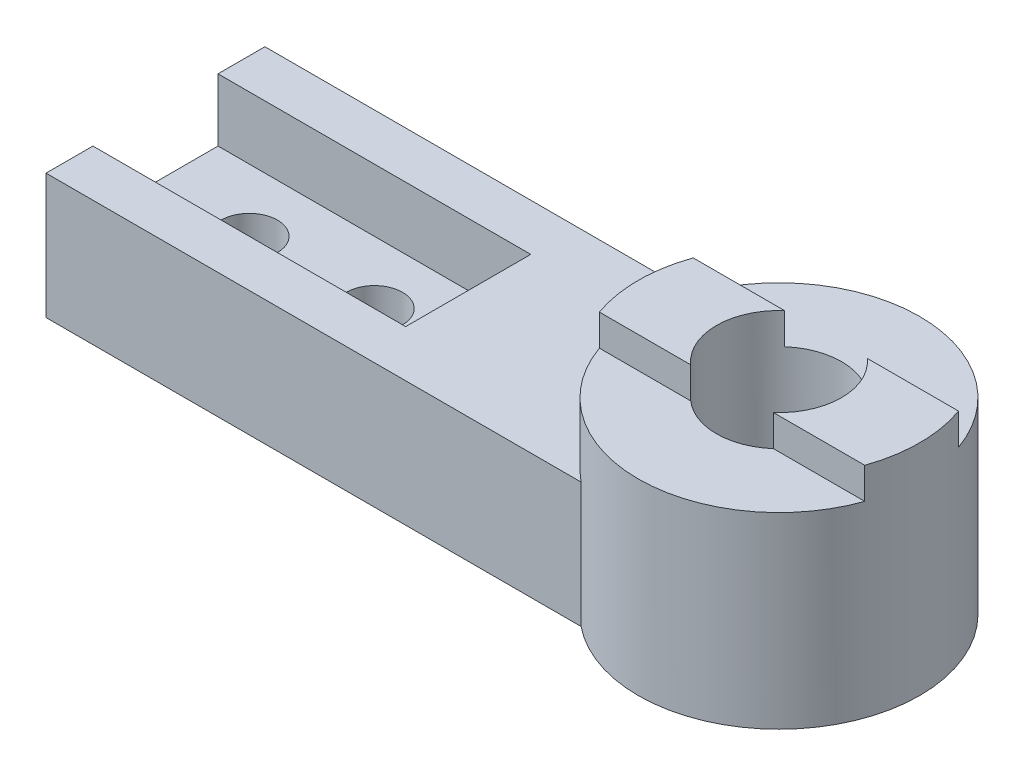
ISO-10303-21;
HEADER;
FILE_DESCRIPTION(('STEP AP214'),'2;1');
FILE_NAME('part.step','',(''),(''),'','','');
FILE_SCHEMA(('AUTOMOTIVE_DESIGN { 1 0 10303 214 1 1 1 1 }'));
ENDSEC;
DATA;
#1=APPLICATION_CONTEXT('core data for automotive mechanical design processes');
#2=APPLICATION_PROTOCOL_DEFINITION('international standard','automotive_design',2000,#1);
#3=PRODUCT_CONTEXT('',#1,'mechanical');
#4=PRODUCT('Part','Part','',(#3));
#5=PRODUCT_RELATED_PRODUCT_CATEGORY('part','',(#4));
#6=PRODUCT_DEFINITION_FORMATION('','',#4);
#7=PRODUCT_DEFINITION_CONTEXT('part definition',#1,'design');
#8=PRODUCT_DEFINITION('design','',#6,#7);
#9=PRODUCT_DEFINITION_SHAPE('','',#8);
#10=(LENGTH_UNIT() NAMED_UNIT(*) SI_UNIT(.MILLI.,.METRE.));
#11=(NAMED_UNIT(*) PLANE_ANGLE_UNIT() SI_UNIT($,.RADIAN.));
#12=(NAMED_UNIT(*) SI_UNIT($,.STERADIAN.) SOLID_ANGLE_UNIT());
#13=UNCERTAINTY_MEASURE_WITH_UNIT(LENGTH_MEASURE(1.E-05),#10,'distance_accuracy_value','');
#14=(GEOMETRIC_REPRESENTATION_CONTEXT(3) GLOBAL_UNCERTAINTY_ASSIGNED_CONTEXT((#13)) GLOBAL_UNIT_ASSIGNED_CONTEXT((#10,
#11,#12)) REPRESENTATION_CONTEXT('',''));
#15=CARTESIAN_POINT('',(0.,0.,0.));
#16=DIRECTION('',(0.,0.,1.));
#17=DIRECTION('',(1.,0.,0.));
#18=AXIS2_PLACEMENT_3D('',#15,#16,#17);
#19=CARTESIAN_POINT('',(0.,30.,0.));
#20=DIRECTION('',(0.,-1.,0.));
#21=DIRECTION('',(0.,0.,-1.));
#22=AXIS2_PLACEMENT_3D('',#19,#20,#21);
#23=CYLINDRICAL_SURFACE('',#22,22.5);
#24=CARTESIAN_POINT('',(0.,30.,0.));
#25=DIRECTION('',(0.,1.,0.));
#26=DIRECTION('',(0.,0.,1.));
#27=AXIS2_PLACEMENT_3D('',#24,#25,#26);
#28=CIRCLE('',#27,22.5);
#29=CARTESIAN_POINT('',(21.2132034355964,30.,-7.5));
#30=VERTEX_POINT('',#29);
#31=CARTESIAN_POINT('',(-21.2132034355964,30.,-7.5));
#32=VERTEX_POINT('',#31);
#33=EDGE_CURVE('E11',#30,#32,#28,.T.);
#34=ORIENTED_EDGE('',*,*,#33,.F.);
#35=DIRECTION('',(0.,-1.,0.));
#36=VECTOR('',#35,1.);
#37=CARTESIAN_POINT('',(21.2132034355964,35.,-7.5));
#38=LINE('',#37,#36);
#39=CARTESIAN_POINT('',(21.2132034355964,35.,-7.5));
#40=VERTEX_POINT('',#39);
#41=EDGE_CURVE('E291',#40,#30,#38,.T.);
#42=ORIENTED_EDGE('',*,*,#41,.F.);
#43=CARTESIAN_POINT('',(0.,35.,0.));
#44=DIRECTION('',(0.,1.,0.));
#45=DIRECTION('',(0.,0.,1.));
#46=AXIS2_PLACEMENT_3D('',#43,#44,#45);
#47=CIRCLE('',#46,22.5);
#48=CARTESIAN_POINT('',(21.2132034355964,35.,7.5));
#49=VERTEX_POINT('',#48);
#50=EDGE_CURVE('E275',#49,#40,#47,.T.);
#51=ORIENTED_EDGE('',*,*,#50,.F.);
#52=DIRECTION('',(0.,-1.,0.));
#53=VECTOR('',#52,1.);
#54=CARTESIAN_POINT('',(21.2132034355964,35.,7.5));
#55=LINE('',#54,#53);
#56=CARTESIAN_POINT('',(21.2132034355964,30.,7.5));
#57=VERTEX_POINT('',#56);
#58=EDGE_CURVE('E295',#49,#57,#55,.T.);
#59=ORIENTED_EDGE('',*,*,#58,.T.);
#60=CARTESIAN_POINT('',(-21.2132034355964,30.,7.5));
#61=VERTEX_POINT('',#60);
#62=EDGE_CURVE('E54',#61,#57,#28,.T.);
#63=ORIENTED_EDGE('',*,*,#62,.F.);
#64=DIRECTION('',(0.,-1.,0.));
#65=VECTOR('',#64,1.);
#66=CARTESIAN_POINT('',(-21.2132034355964,35.,7.5));
#67=LINE('',#66,#65);
#68=CARTESIAN_POINT('',(-21.2132034355964,35.,7.5));
#69=VERTEX_POINT('',#68);
#70=EDGE_CURVE('E233',#69,#61,#67,.T.);
#71=ORIENTED_EDGE('',*,*,#70,.F.);
#72=CARTESIAN_POINT('',(0.,35.,0.));
#73=DIRECTION('',(0.,1.,0.));
#74=DIRECTION('',(0.,0.,1.));
#75=AXIS2_PLACEMENT_3D('',#72,#73,#74);
#76=CIRCLE('',#75,22.5);
#77=CARTESIAN_POINT('',(-21.2132034355964,35.,-7.5));
#78=VERTEX_POINT('',#77);
#79=EDGE_CURVE('E251',#78,#69,#76,.T.);
#80=ORIENTED_EDGE('',*,*,#79,.F.);
#81=DIRECTION('',(0.,-1.,0.));
#82=VECTOR('',#81,1.);
#83=CARTESIAN_POINT('',(-21.2132034355964,35.,-7.5));
#84=LINE('',#83,#82);
#85=EDGE_CURVE('E242',#78,#32,#84,.T.);
#86=ORIENTED_EDGE('',*,*,#85,.T.);
#87=EDGE_LOOP('',(#34,#42,#51,#59,#63,#71,#80,#86));
#88=FACE_BOUND('',#87,.T.);
#89=DIRECTION('',(0.,-1.,0.));
#90=VECTOR('',#89,1.);
#91=CARTESIAN_POINT('',(-14.1421356237309,20.,-17.5));
#92=LINE('',#91,#90);
#93=CARTESIAN_POINT('',(-14.1421356237309,20.,-17.5));
#94=VERTEX_POINT('',#93);
#95=CARTESIAN_POINT('',(-14.1421356237309,0.,-17.5));
#96=VERTEX_POINT('',#95);
#97=EDGE_CURVE('E207',#94,#96,#92,.T.);
#98=ORIENTED_EDGE('',*,*,#97,.F.);
#99=CARTESIAN_POINT('',(0.,20.,0.));
#100=DIRECTION('',(0.,-1.,0.));
#101=DIRECTION('',(0.,0.,1.));
#102=AXIS2_PLACEMENT_3D('',#99,#100,#101);
#103=CIRCLE('',#102,22.5);
#104=CARTESIAN_POINT('',(-14.1421356237309,20.,17.5));
#105=VERTEX_POINT('',#104);
#106=EDGE_CURVE('E69',#105,#94,#103,.T.);
#107=ORIENTED_EDGE('',*,*,#106,.F.);
#108=DIRECTION('',(0.,-1.,0.));
#109=VECTOR('',#108,1.);
#110=CARTESIAN_POINT('',(-14.1421356237309,20.,17.5));
#111=LINE('',#110,#109);
#112=CARTESIAN_POINT('',(-14.1421356237309,0.,17.5));
#113=VERTEX_POINT('',#112);
#114=EDGE_CURVE('E222',#105,#113,#111,.T.);
#115=ORIENTED_EDGE('',*,*,#114,.T.);
#116=CARTESIAN_POINT('',(0.,0.,0.));
#117=DIRECTION('',(0.,1.,0.));
#118=DIRECTION('',(0.,0.,1.));
#119=AXIS2_PLACEMENT_3D('',#116,#117,#118);
#120=CIRCLE('',#119,22.5);
#121=EDGE_CURVE('E48',#113,#96,#120,.T.);
#122=ORIENTED_EDGE('',*,*,#121,.T.);
#123=EDGE_LOOP('',(#98,#107,#115,#122));
#124=FACE_BOUND('',#123,.T.);
#125=ADVANCED_FACE('F45',(#88,#124),#23,.T.);
#126=CARTESIAN_POINT('',(0.,30.,0.));
#127=DIRECTION('',(0.,1.,0.));
#128=DIRECTION('',(0.,0.,1.));
#129=AXIS2_PLACEMENT_3D('',#126,#127,#128);
#130=PLANE('',#129);
#131=CARTESIAN_POINT('',(0.,30.,0.));
#132=DIRECTION('',(0.,1.,0.));
#133=DIRECTION('',(0.,0.,1.));
#134=AXIS2_PLACEMENT_3D('',#131,#132,#133);
#135=CIRCLE('',#134,10.);
#136=CARTESIAN_POINT('',(-6.61437827766148,30.,7.5));
#137=VERTEX_POINT('',#136);
#138=CARTESIAN_POINT('',(6.61437827766148,30.,7.5));
#139=VERTEX_POINT('',#138);
#140=EDGE_CURVE('E308',#137,#139,#135,.T.);
#141=ORIENTED_EDGE('',*,*,#140,.F.);
#142=DIRECTION('',(1.,0.,0.));
#143=VECTOR('',#142,1.);
#144=CARTESIAN_POINT('',(-6.61437827766148,30.,7.5));
#145=LINE('',#144,#143);
#146=EDGE_CURVE('E250',#61,#137,#145,.T.);
#147=ORIENTED_EDGE('',*,*,#146,.F.);
#148=ORIENTED_EDGE('',*,*,#62,.T.);
#149=DIRECTION('',(1.,0.,0.));
#150=VECTOR('',#149,1.);
#151=CARTESIAN_POINT('',(21.2132034355964,30.,7.5));
#152=LINE('',#151,#150);
#153=EDGE_CURVE('E255',#139,#57,#152,.T.);
#154=ORIENTED_EDGE('',*,*,#153,.F.);
#155=EDGE_LOOP('',(#141,#147,#148,#154));
#156=FACE_BOUND('',#155,.T.);
#157=ADVANCED_FACE('F325',(#156),#130,.T.);
#158=ORIENTED_EDGE('',*,*,#33,.T.);
#159=DIRECTION('',(-1.,0.,0.));
#160=VECTOR('',#159,1.);
#161=CARTESIAN_POINT('',(-6.61437827766148,30.,-7.5));
#162=LINE('',#161,#160);
#163=CARTESIAN_POINT('',(-6.61437827766148,30.,-7.5));
#164=VERTEX_POINT('',#163);
#165=EDGE_CURVE('E247',#164,#32,#162,.T.);
#166=ORIENTED_EDGE('',*,*,#165,.F.);
#167=CARTESIAN_POINT('',(6.61437827766148,30.,-7.5));
#168=VERTEX_POINT('',#167);
#169=EDGE_CURVE('E304',#168,#164,#135,.T.);
#170=ORIENTED_EDGE('',*,*,#169,.F.);
#171=DIRECTION('',(-1.,0.,0.));
#172=VECTOR('',#171,1.);
#173=CARTESIAN_POINT('',(21.2132034355964,30.,-7.5));
#174=LINE('',#173,#172);
#175=EDGE_CURVE('E272',#30,#168,#174,.T.);
#176=ORIENTED_EDGE('',*,*,#175,.F.);
#177=EDGE_LOOP('',(#158,#166,#170,#176));
#178=FACE_BOUND('',#177,.T.);
#179=ADVANCED_FACE('F341',(#178),#130,.T.);
#180=CARTESIAN_POINT('',(0.,0.,0.));
#181=DIRECTION('',(0.,1.,0.));
#182=DIRECTION('',(0.,0.,1.));
#183=AXIS2_PLACEMENT_3D('',#180,#181,#182);
#184=PLANE('',#183);
#185=CARTESIAN_POINT('',(-84.6832270174227,0.,0.));
#186=DIRECTION('',(0.,1.,0.));
#187=DIRECTION('',(0.,0.,1.));
#188=AXIS2_PLACEMENT_3D('',#185,#186,#187);
#189=CIRCLE('',#188,4.5);
#190=CARTESIAN_POINT('',(-84.6832270174227,0.,4.5));
#191=VERTEX_POINT('',#190);
#192=EDGE_CURVE('E402',#191,#191,#189,.T.);
#193=ORIENTED_EDGE('',*,*,#192,.T.);
#194=EDGE_LOOP('',(#193));
#195=FACE_BOUND('',#194,.T.);
#196=CARTESIAN_POINT('',(-64.6832270174227,0.,0.));
#197=DIRECTION('',(0.,1.,0.));
#198=DIRECTION('',(0.,0.,1.));
#199=AXIS2_PLACEMENT_3D('',#196,#197,#198);
#200=CIRCLE('',#199,4.5);
#201=CARTESIAN_POINT('',(-64.6832270174227,0.,4.5));
#202=VERTEX_POINT('',#201);
#203=EDGE_CURVE('E405',#202,#202,#200,.T.);
#204=ORIENTED_EDGE('',*,*,#203,.T.);
#205=EDGE_LOOP('',(#204));
#206=FACE_BOUND('',#205,.T.);
#207=ORIENTED_EDGE('',*,*,#121,.F.);
#208=DIRECTION('',(1.,0.,0.));
#209=VECTOR('',#208,1.);
#210=CARTESIAN_POINT('',(-14.1421356237309,0.,17.5));
#211=LINE('',#210,#209);
#212=CARTESIAN_POINT('',(-99.6832270174227,0.,17.5));
#213=VERTEX_POINT('',#212);
#214=EDGE_CURVE('E197',#213,#113,#211,.T.);
#215=ORIENTED_EDGE('',*,*,#214,.F.);
#216=DIRECTION('',(0.,0.,1.));
#217=VECTOR('',#216,1.);
#218=CARTESIAN_POINT('',(-99.6832270174227,0.,-17.5));
#219=LINE('',#218,#217);
#220=CARTESIAN_POINT('',(-99.6832270174227,0.,-17.5));
#221=VERTEX_POINT('',#220);
#222=EDGE_CURVE('E212',#221,#213,#219,.T.);
#223=ORIENTED_EDGE('',*,*,#222,.F.);
#224=DIRECTION('',(-1.,0.,0.));
#225=VECTOR('',#224,1.);
#226=CARTESIAN_POINT('',(-14.1421356237309,0.,-17.5));
#227=LINE('',#226,#225);
#228=EDGE_CURVE('E208',#96,#221,#227,.T.);
#229=ORIENTED_EDGE('',*,*,#228,.F.);
#230=EDGE_LOOP('',(#207,#215,#223,#229));
#231=FACE_BOUND('',#230,.T.);
#232=CARTESIAN_POINT('',(0.,0.,0.));
#233=DIRECTION('',(0.,1.,0.));
#234=DIRECTION('',(0.,0.,1.));
#235=AXIS2_PLACEMENT_3D('',#232,#233,#234);
#236=CIRCLE('',#235,10.);
#237=CARTESIAN_POINT('',(0.,0.,10.));
#238=VERTEX_POINT('',#237);
#239=EDGE_CURVE('E303',#238,#238,#236,.T.);
#240=ORIENTED_EDGE('',*,*,#239,.T.);
#241=EDGE_LOOP('',(#240));
#242=FACE_BOUND('',#241,.T.);
#243=ADVANCED_FACE('F364',(#195,#206,#231,#242),#184,.F.);
#244=CARTESIAN_POINT('',(0.,30.,0.));
#245=DIRECTION('',(0.,-1.,0.));
#246=DIRECTION('',(0.,0.,-1.));
#247=AXIS2_PLACEMENT_3D('',#244,#245,#246);
#248=CYLINDRICAL_SURFACE('',#247,10.);
#249=ORIENTED_EDGE('',*,*,#169,.T.);
#250=DIRECTION('',(0.,-1.,0.));
#251=VECTOR('',#250,1.);
#252=CARTESIAN_POINT('',(-6.61437827766148,35.,-7.5));
#253=LINE('',#252,#251);
#254=CARTESIAN_POINT('',(-6.61437827766148,35.,-7.5));
#255=VERTEX_POINT('',#254);
#256=EDGE_CURVE('E239',#255,#164,#253,.T.);
#257=ORIENTED_EDGE('',*,*,#256,.F.);
#258=CARTESIAN_POINT('',(0.,35.,0.));
#259=DIRECTION('',(0.,-1.,0.));
#260=DIRECTION('',(0.,0.,1.));
#261=AXIS2_PLACEMENT_3D('',#258,#259,#260);
#262=CIRCLE('',#261,10.);
#263=CARTESIAN_POINT('',(-6.61437827766148,35.,7.5));
#264=VERTEX_POINT('',#263);
#265=EDGE_CURVE('E258',#264,#255,#262,.T.);
#266=ORIENTED_EDGE('',*,*,#265,.F.);
#267=DIRECTION('',(0.,-1.,0.));
#268=VECTOR('',#267,1.);
#269=CARTESIAN_POINT('',(-6.61437827766148,35.,7.5));
#270=LINE('',#269,#268);
#271=EDGE_CURVE('E236',#264,#137,#270,.T.);
#272=ORIENTED_EDGE('',*,*,#271,.T.);
#273=ORIENTED_EDGE('',*,*,#140,.T.);
#274=DIRECTION('',(0.,-1.,0.));
#275=VECTOR('',#274,1.);
#276=CARTESIAN_POINT('',(6.61437827766148,35.,7.5));
#277=LINE('',#276,#275);
#278=CARTESIAN_POINT('',(6.61437827766148,35.,7.5));
#279=VERTEX_POINT('',#278);
#280=EDGE_CURVE('E299',#279,#139,#277,.T.);
#281=ORIENTED_EDGE('',*,*,#280,.F.);
#282=CARTESIAN_POINT('',(0.,35.,0.));
#283=DIRECTION('',(0.,-1.,0.));
#284=DIRECTION('',(0.,0.,1.));
#285=AXIS2_PLACEMENT_3D('',#282,#283,#284);
#286=CIRCLE('',#285,10.);
#287=CARTESIAN_POINT('',(6.61437827766148,35.,-7.5));
#288=VERTEX_POINT('',#287);
#289=EDGE_CURVE('E267',#288,#279,#286,.T.);
#290=ORIENTED_EDGE('',*,*,#289,.F.);
#291=DIRECTION('',(0.,-1.,0.));
#292=VECTOR('',#291,1.);
#293=CARTESIAN_POINT('',(6.61437827766148,35.,-7.5));
#294=LINE('',#293,#292);
#295=EDGE_CURVE('E281',#288,#168,#294,.T.);
#296=ORIENTED_EDGE('',*,*,#295,.T.);
#297=EDGE_LOOP('',(#249,#257,#266,#272,#273,#281,#290,#296));
#298=FACE_BOUND('',#297,.T.);
#299=ORIENTED_EDGE('',*,*,#239,.F.);
#300=EDGE_LOOP('',(#299));
#301=FACE_BOUND('',#300,.T.);
#302=ADVANCED_FACE('F318',(#298,#301),#248,.F.);
#303=CARTESIAN_POINT('',(21.2132034355964,35.,7.5));
#304=DIRECTION('',(0.,0.,-1.));
#305=DIRECTION('',(-1.,0.,0.));
#306=AXIS2_PLACEMENT_3D('',#303,#304,#305);
#307=PLANE('',#306);
#308=ORIENTED_EDGE('',*,*,#153,.T.);
#309=ORIENTED_EDGE('',*,*,#58,.F.);
#310=DIRECTION('',(1.,0.,0.));
#311=VECTOR('',#310,1.);
#312=CARTESIAN_POINT('',(21.2132034355964,35.,7.5));
#313=LINE('',#312,#311);
#314=EDGE_CURVE('E271',#279,#49,#313,.T.);
#315=ORIENTED_EDGE('',*,*,#314,.F.);
#316=ORIENTED_EDGE('',*,*,#280,.T.);
#317=EDGE_LOOP('',(#308,#309,#315,#316));
#318=FACE_BOUND('',#317,.T.);
#319=ADVANCED_FACE('F329',(#318),#307,.F.);
#320=CARTESIAN_POINT('',(21.2132034355964,35.,-7.5));
#321=DIRECTION('',(0.,0.,1.));
#322=DIRECTION('',(1.,0.,0.));
#323=AXIS2_PLACEMENT_3D('',#320,#321,#322);
#324=PLANE('',#323);
#325=ORIENTED_EDGE('',*,*,#175,.T.);
#326=ORIENTED_EDGE('',*,*,#295,.F.);
#327=DIRECTION('',(-1.,0.,0.));
#328=VECTOR('',#327,1.);
#329=CARTESIAN_POINT('',(21.2132034355964,35.,-7.5));
#330=LINE('',#329,#328);
#331=EDGE_CURVE('E278',#40,#288,#330,.T.);
#332=ORIENTED_EDGE('',*,*,#331,.F.);
#333=ORIENTED_EDGE('',*,*,#41,.T.);
#334=EDGE_LOOP('',(#325,#326,#332,#333));
#335=FACE_BOUND('',#334,.T.);
#336=ADVANCED_FACE('F337',(#335),#324,.F.);
#337=CARTESIAN_POINT('',(0.,35.,0.));
#338=DIRECTION('',(0.,1.,0.));
#339=DIRECTION('',(0.,0.,1.));
#340=AXIS2_PLACEMENT_3D('',#337,#338,#339);
#341=PLANE('',#340);
#342=ORIENTED_EDGE('',*,*,#289,.T.);
#343=ORIENTED_EDGE('',*,*,#314,.T.);
#344=ORIENTED_EDGE('',*,*,#50,.T.);
#345=ORIENTED_EDGE('',*,*,#331,.T.);
#346=EDGE_LOOP('',(#342,#343,#344,#345));
#347=FACE_BOUND('',#346,.T.);
#348=ADVANCED_FACE('F332',(#347),#341,.T.);
#349=CARTESIAN_POINT('',(-6.61437827766148,35.,7.5));
#350=DIRECTION('',(0.,0.,-1.));
#351=DIRECTION('',(-1.,0.,0.));
#352=AXIS2_PLACEMENT_3D('',#349,#350,#351);
#353=PLANE('',#352);
#354=ORIENTED_EDGE('',*,*,#146,.T.);
#355=ORIENTED_EDGE('',*,*,#271,.F.);
#356=DIRECTION('',(1.,0.,0.));
#357=VECTOR('',#356,1.);
#358=CARTESIAN_POINT('',(-6.61437827766148,35.,7.5));
#359=LINE('',#358,#357);
#360=EDGE_CURVE('E261',#69,#264,#359,.T.);
#361=ORIENTED_EDGE('',*,*,#360,.F.);
#362=ORIENTED_EDGE('',*,*,#70,.T.);
#363=EDGE_LOOP('',(#354,#355,#361,#362));
#364=FACE_BOUND('',#363,.T.);
#365=ADVANCED_FACE('F353',(#364),#353,.F.);
#366=CARTESIAN_POINT('',(-6.61437827766148,35.,-7.5));
#367=DIRECTION('',(0.,0.,1.));
#368=DIRECTION('',(1.,0.,0.));
#369=AXIS2_PLACEMENT_3D('',#366,#367,#368);
#370=PLANE('',#369);
#371=ORIENTED_EDGE('',*,*,#165,.T.);
#372=ORIENTED_EDGE('',*,*,#85,.F.);
#373=DIRECTION('',(-1.,0.,0.));
#374=VECTOR('',#373,1.);
#375=CARTESIAN_POINT('',(-6.61437827766148,35.,-7.5));
#376=LINE('',#375,#374);
#377=EDGE_CURVE('E246',#255,#78,#376,.T.);
#378=ORIENTED_EDGE('',*,*,#377,.F.);
#379=ORIENTED_EDGE('',*,*,#256,.T.);
#380=EDGE_LOOP('',(#371,#372,#378,#379));
#381=FACE_BOUND('',#380,.T.);
#382=ADVANCED_FACE('F349',(#381),#370,.F.);
#383=CARTESIAN_POINT('',(0.,35.,0.));
#384=DIRECTION('',(0.,1.,0.));
#385=DIRECTION('',(0.,0.,1.));
#386=AXIS2_PLACEMENT_3D('',#383,#384,#385);
#387=PLANE('',#386);
#388=ORIENTED_EDGE('',*,*,#79,.T.);
#389=ORIENTED_EDGE('',*,*,#360,.T.);
#390=ORIENTED_EDGE('',*,*,#265,.T.);
#391=ORIENTED_EDGE('',*,*,#377,.T.);
#392=EDGE_LOOP('',(#388,#389,#390,#391));
#393=FACE_BOUND('',#392,.T.);
#394=ADVANCED_FACE('F351',(#393),#387,.T.);
#395=CARTESIAN_POINT('',(-14.1421356237309,20.,-17.5));
#396=DIRECTION('',(0.,0.,1.));
#397=DIRECTION('',(1.,0.,0.));
#398=AXIS2_PLACEMENT_3D('',#395,#396,#397);
#399=PLANE('',#398);
#400=ORIENTED_EDGE('',*,*,#228,.T.);
#401=DIRECTION('',(0.,-1.,0.));
#402=VECTOR('',#401,1.);
#403=CARTESIAN_POINT('',(-99.6832270174227,20.,-17.5));
#404=LINE('',#403,#402);
#405=CARTESIAN_POINT('',(-99.6832270174227,20.,-17.5));
#406=VERTEX_POINT('',#405);
#407=EDGE_CURVE('E229',#406,#221,#404,.T.);
#408=ORIENTED_EDGE('',*,*,#407,.F.);
#409=DIRECTION('',(-1.,0.,0.));
#410=VECTOR('',#409,1.);
#411=CARTESIAN_POINT('',(-14.1421356237309,20.,-17.5));
#412=LINE('',#411,#410);
#413=EDGE_CURVE('E193',#94,#406,#412,.T.);
#414=ORIENTED_EDGE('',*,*,#413,.F.);
#415=ORIENTED_EDGE('',*,*,#97,.T.);
#416=EDGE_LOOP('',(#400,#408,#414,#415));
#417=FACE_BOUND('',#416,.T.);
#418=ADVANCED_FACE('F362',(#417),#399,.F.);
#419=CARTESIAN_POINT('',(-99.6832270174227,20.,-17.5));
#420=DIRECTION('',(1.,0.,0.));
#421=DIRECTION('',(0.,0.,-1.));
#422=AXIS2_PLACEMENT_3D('',#419,#420,#421);
#423=PLANE('',#422);
#424=DIRECTION('',(0.,0.,1.));
#425=VECTOR('',#424,1.);
#426=CARTESIAN_POINT('',(-99.6832270174227,10.,10.));
#427=LINE('',#426,#425);
#428=CARTESIAN_POINT('',(-99.6832270174227,10.,-10.));
#429=VERTEX_POINT('',#428);
#430=CARTESIAN_POINT('',(-99.6832270174227,10.,10.));
#431=VERTEX_POINT('',#430);
#432=EDGE_CURVE('E168',#429,#431,#427,.T.);
#433=ORIENTED_EDGE('',*,*,#432,.F.);
#434=DIRECTION('',(0.,1.,0.));
#435=VECTOR('',#434,1.);
#436=CARTESIAN_POINT('',(-99.6832270174227,10.,-10.));
#437=LINE('',#436,#435);
#438=CARTESIAN_POINT('',(-99.6832270174227,20.,-10.));
#439=VERTEX_POINT('',#438);
#440=EDGE_CURVE('E213',#429,#439,#437,.T.);
#441=ORIENTED_EDGE('',*,*,#440,.T.);
#442=DIRECTION('',(0.,0.,1.));
#443=VECTOR('',#442,1.);
#444=CARTESIAN_POINT('',(-99.6832270174227,20.,-17.5));
#445=LINE('',#444,#443);
#446=EDGE_CURVE('E198',#406,#439,#445,.T.);
#447=ORIENTED_EDGE('',*,*,#446,.F.);
#448=ORIENTED_EDGE('',*,*,#407,.T.);
#449=ORIENTED_EDGE('',*,*,#222,.T.);
#450=DIRECTION('',(0.,-1.,0.));
#451=VECTOR('',#450,1.);
#452=CARTESIAN_POINT('',(-99.6832270174227,20.,17.5));
#453=LINE('',#452,#451);
#454=CARTESIAN_POINT('',(-99.6832270174227,20.,17.5));
#455=VERTEX_POINT('',#454);
#456=EDGE_CURVE('E225',#455,#213,#453,.T.);
#457=ORIENTED_EDGE('',*,*,#456,.F.);
#458=CARTESIAN_POINT('',(-99.6832270174227,20.,9.99999999999999));
#459=VERTEX_POINT('',#458);
#460=EDGE_CURVE('E183',#459,#455,#445,.T.);
#461=ORIENTED_EDGE('',*,*,#460,.F.);
#462=DIRECTION('',(0.,1.,0.));
#463=VECTOR('',#462,1.);
#464=CARTESIAN_POINT('',(-99.6832270174227,10.,10.));
#465=LINE('',#464,#463);
#466=EDGE_CURVE('E61',#431,#459,#465,.T.);
#467=ORIENTED_EDGE('',*,*,#466,.F.);
#468=EDGE_LOOP('',(#433,#441,#447,#448,#449,#457,#461,#467));
#469=FACE_BOUND('',#468,.T.);
#470=ADVANCED_FACE('F181',(#469),#423,.F.);
#471=CARTESIAN_POINT('',(-14.1421356237309,20.,17.5));
#472=DIRECTION('',(0.,0.,-1.));
#473=DIRECTION('',(-1.,0.,0.));
#474=AXIS2_PLACEMENT_3D('',#471,#472,#473);
#475=PLANE('',#474);
#476=ORIENTED_EDGE('',*,*,#214,.T.);
#477=ORIENTED_EDGE('',*,*,#114,.F.);
#478=DIRECTION('',(1.,0.,0.));
#479=VECTOR('',#478,1.);
#480=CARTESIAN_POINT('',(-14.1421356237309,20.,17.5));
#481=LINE('',#480,#479);
#482=EDGE_CURVE('E202',#455,#105,#481,.T.);
#483=ORIENTED_EDGE('',*,*,#482,.F.);
#484=ORIENTED_EDGE('',*,*,#456,.T.);
#485=EDGE_LOOP('',(#476,#477,#483,#484));
#486=FACE_BOUND('',#485,.T.);
#487=ADVANCED_FACE('F370',(#486),#475,.F.);
#488=CARTESIAN_POINT('',(0.,20.,0.));
#489=DIRECTION('',(0.,1.,0.));
#490=DIRECTION('',(0.,0.,1.));
#491=AXIS2_PLACEMENT_3D('',#488,#489,#490);
#492=PLANE('',#491);
#493=DIRECTION('',(-1.,0.,0.));
#494=VECTOR('',#493,1.);
#495=CARTESIAN_POINT('',(-99.6832270174227,20.,-10.));
#496=LINE('',#495,#494);
#497=CARTESIAN_POINT('',(-49.6832270174227,20.,-10.));
#498=VERTEX_POINT('',#497);
#499=EDGE_CURVE('E178',#498,#439,#496,.T.);
#500=ORIENTED_EDGE('',*,*,#499,.F.);
#501=DIRECTION('',(0.,0.,-1.));
#502=VECTOR('',#501,1.);
#503=CARTESIAN_POINT('',(-49.6832270174227,20.,-10.));
#504=LINE('',#503,#502);
#505=CARTESIAN_POINT('',(-49.6832270174227,20.,9.99999999999999));
#506=VERTEX_POINT('',#505);
#507=EDGE_CURVE('E421',#506,#498,#504,.T.);
#508=ORIENTED_EDGE('',*,*,#507,.F.);
#509=DIRECTION('',(1.,0.,0.));
#510=VECTOR('',#509,1.);
#511=CARTESIAN_POINT('',(-49.6832270174227,20.,9.99999999999999));
#512=LINE('',#511,#510);
#513=EDGE_CURVE('E418',#459,#506,#512,.T.);
#514=ORIENTED_EDGE('',*,*,#513,.F.);
#515=ORIENTED_EDGE('',*,*,#460,.T.);
#516=ORIENTED_EDGE('',*,*,#482,.T.);
#517=ORIENTED_EDGE('',*,*,#106,.T.);
#518=ORIENTED_EDGE('',*,*,#413,.T.);
#519=ORIENTED_EDGE('',*,*,#446,.T.);
#520=EDGE_LOOP('',(#500,#508,#514,#515,#516,#517,#518,#519));
#521=FACE_BOUND('',#520,.T.);
#522=ADVANCED_FACE('F367',(#521),#492,.T.);
#523=CARTESIAN_POINT('',(-99.6832270174227,10.,-10.));
#524=DIRECTION('',(0.,0.,-1.));
#525=DIRECTION('',(-1.,0.,0.));
#526=AXIS2_PLACEMENT_3D('',#523,#524,#525);
#527=PLANE('',#526);
#528=ORIENTED_EDGE('',*,*,#499,.T.);
#529=ORIENTED_EDGE('',*,*,#440,.F.);
#530=DIRECTION('',(-1.,0.,0.));
#531=VECTOR('',#530,1.);
#532=CARTESIAN_POINT('',(-99.6832270174227,10.,-10.));
#533=LINE('',#532,#531);
#534=CARTESIAN_POINT('',(-49.6832270174227,10.,-10.));
#535=VERTEX_POINT('',#534);
#536=EDGE_CURVE('E174',#535,#429,#533,.T.);
#537=ORIENTED_EDGE('',*,*,#536,.F.);
#538=DIRECTION('',(0.,1.,0.));
#539=VECTOR('',#538,1.);
#540=CARTESIAN_POINT('',(-49.6832270174227,10.,-10.));
#541=LINE('',#540,#539);
#542=EDGE_CURVE('E188',#535,#498,#541,.T.);
#543=ORIENTED_EDGE('',*,*,#542,.T.);
#544=EDGE_LOOP('',(#528,#529,#537,#543));
#545=FACE_BOUND('',#544,.T.);
#546=ADVANCED_FACE('F378',(#545),#527,.F.);
#547=CARTESIAN_POINT('',(-49.6832270174227,10.,-10.));
#548=DIRECTION('',(1.,0.,0.));
#549=DIRECTION('',(0.,0.,-1.));
#550=AXIS2_PLACEMENT_3D('',#547,#548,#549);
#551=PLANE('',#550);
#552=ORIENTED_EDGE('',*,*,#507,.T.);
#553=ORIENTED_EDGE('',*,*,#542,.F.);
#554=DIRECTION('',(0.,0.,-1.));
#555=VECTOR('',#554,1.);
#556=CARTESIAN_POINT('',(-49.6832270174227,10.,-10.));
#557=LINE('',#556,#555);
#558=CARTESIAN_POINT('',(-49.6832270174227,10.,9.99999999999999));
#559=VERTEX_POINT('',#558);
#560=EDGE_CURVE('E167',#559,#535,#557,.T.);
#561=ORIENTED_EDGE('',*,*,#560,.F.);
#562=DIRECTION('',(0.,1.,0.));
#563=VECTOR('',#562,1.);
#564=CARTESIAN_POINT('',(-49.6832270174227,10.,9.99999999999999));
#565=LINE('',#564,#563);
#566=EDGE_CURVE('E162',#559,#506,#565,.T.);
#567=ORIENTED_EDGE('',*,*,#566,.T.);
#568=EDGE_LOOP('',(#552,#553,#561,#567));
#569=FACE_BOUND('',#568,.T.);
#570=ADVANCED_FACE('F432',(#569),#551,.F.);
#571=CARTESIAN_POINT('',(-49.6832270174227,10.,9.99999999999999));
#572=DIRECTION('',(0.,0.,1.));
#573=DIRECTION('',(1.,0.,0.));
#574=AXIS2_PLACEMENT_3D('',#571,#572,#573);
#575=PLANE('',#574);
#576=ORIENTED_EDGE('',*,*,#513,.T.);
#577=ORIENTED_EDGE('',*,*,#566,.F.);
#578=DIRECTION('',(1.,0.,0.));
#579=VECTOR('',#578,1.);
#580=CARTESIAN_POINT('',(-49.6832270174227,10.,9.99999999999999));
#581=LINE('',#580,#579);
#582=EDGE_CURVE('E159',#431,#559,#581,.T.);
#583=ORIENTED_EDGE('',*,*,#582,.F.);
#584=ORIENTED_EDGE('',*,*,#466,.T.);
#585=EDGE_LOOP('',(#576,#577,#583,#584));
#586=FACE_BOUND('',#585,.T.);
#587=ADVANCED_FACE('F161',(#586),#575,.F.);
#588=CARTESIAN_POINT('',(0.,10.,0.));
#589=DIRECTION('',(0.,-1.,0.));
#590=DIRECTION('',(0.,0.,-1.));
#591=AXIS2_PLACEMENT_3D('',#588,#589,#590);
#592=PLANE('',#591);
#593=CARTESIAN_POINT('',(-84.6832270174227,10.,0.));
#594=DIRECTION('',(0.,1.,0.));
#595=DIRECTION('',(0.,0.,1.));
#596=AXIS2_PLACEMENT_3D('',#593,#594,#595);
#597=CIRCLE('',#596,4.5);
#598=CARTESIAN_POINT('',(-84.6832270174227,10.,4.5));
#599=VERTEX_POINT('',#598);
#600=EDGE_CURVE('E412',#599,#599,#597,.T.);
#601=ORIENTED_EDGE('',*,*,#600,.F.);
#602=EDGE_LOOP('',(#601));
#603=FACE_BOUND('',#602,.T.);
#604=CARTESIAN_POINT('',(-64.6832270174227,10.,0.));
#605=DIRECTION('',(0.,1.,0.));
#606=DIRECTION('',(0.,0.,1.));
#607=AXIS2_PLACEMENT_3D('',#604,#605,#606);
#608=CIRCLE('',#607,4.5);
#609=CARTESIAN_POINT('',(-64.6832270174227,10.,4.5));
#610=VERTEX_POINT('',#609);
#611=EDGE_CURVE('E408',#610,#610,#608,.T.);
#612=ORIENTED_EDGE('',*,*,#611,.F.);
#613=EDGE_LOOP('',(#612));
#614=FACE_BOUND('',#613,.T.);
#615=ORIENTED_EDGE('',*,*,#432,.T.);
#616=ORIENTED_EDGE('',*,*,#582,.T.);
#617=ORIENTED_EDGE('',*,*,#560,.T.);
#618=ORIENTED_EDGE('',*,*,#536,.T.);
#619=EDGE_LOOP('',(#615,#616,#617,#618));
#620=FACE_BOUND('',#619,.T.);
#621=ADVANCED_FACE('F172',(#603,#614,#620),#592,.F.);
#622=CARTESIAN_POINT('',(-64.6832270174227,0.,0.));
#623=DIRECTION('',(0.,1.,0.));
#624=DIRECTION('',(0.,0.,1.));
#625=AXIS2_PLACEMENT_3D('',#622,#623,#624);
#626=CYLINDRICAL_SURFACE('',#625,4.5);
#627=ORIENTED_EDGE('',*,*,#203,.F.);
#628=EDGE_LOOP('',(#627));
#629=FACE_BOUND('',#628,.T.);
#630=ORIENTED_EDGE('',*,*,#611,.T.);
#631=EDGE_LOOP('',(#630));
#632=FACE_BOUND('',#631,.T.);
#633=ADVANCED_FACE('F442',(#629,#632),#626,.F.);
#634=CARTESIAN_POINT('',(-84.6832270174227,0.,0.));
#635=DIRECTION('',(0.,1.,0.));
#636=DIRECTION('',(0.,0.,1.));
#637=AXIS2_PLACEMENT_3D('',#634,#635,#636);
#638=CYLINDRICAL_SURFACE('',#637,4.5);
#639=ORIENTED_EDGE('',*,*,#192,.F.);
#640=EDGE_LOOP('',(#639));
#641=FACE_BOUND('',#640,.T.);
#642=ORIENTED_EDGE('',*,*,#600,.T.);
#643=EDGE_LOOP('',(#642));
#644=FACE_BOUND('',#643,.T.);
#645=ADVANCED_FACE('F446',(#641,#644),#638,.F.);
#646=CLOSED_SHELL('',(#125,#157,#179,#243,#302,#319,#336,#348,#365,#382,#394,#418,#470,#487,
#522,#546,#570,#587,#621,#633,#645));
#647=MANIFOLD_SOLID_BREP('B2',#646);
#648=ADVANCED_BREP_SHAPE_REPRESENTATION('',(#18,#647),#14);
#649=SHAPE_DEFINITION_REPRESENTATION(#9,#648);
ENDSEC;
END-ISO-10303-21;
